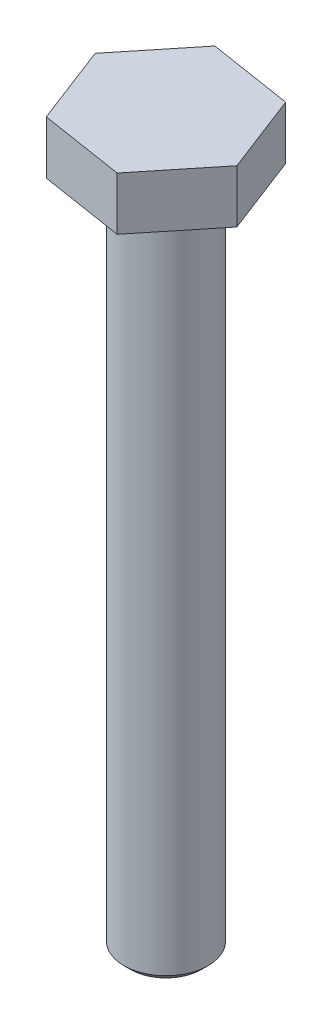
ISO-10303-21;
HEADER;
FILE_DESCRIPTION(('STEP AP214'),'2;1');
FILE_NAME('part.step','',(''),(''),'','','');
FILE_SCHEMA(('AUTOMOTIVE_DESIGN { 1 0 10303 214 1 1 1 1 }'));
ENDSEC;
DATA;
#1=APPLICATION_CONTEXT('core data for automotive mechanical design processes');
#2=APPLICATION_PROTOCOL_DEFINITION('international standard','automotive_design',2000,#1);
#3=PRODUCT_CONTEXT('',#1,'mechanical');
#4=PRODUCT('Part','Part','',(#3));
#5=PRODUCT_RELATED_PRODUCT_CATEGORY('part','',(#4));
#6=PRODUCT_DEFINITION_FORMATION('','',#4);
#7=PRODUCT_DEFINITION_CONTEXT('part definition',#1,'design');
#8=PRODUCT_DEFINITION('design','',#6,#7);
#9=PRODUCT_DEFINITION_SHAPE('','',#8);
#10=(LENGTH_UNIT() NAMED_UNIT(*) SI_UNIT(.MILLI.,.METRE.));
#11=(NAMED_UNIT(*) PLANE_ANGLE_UNIT() SI_UNIT($,.RADIAN.));
#12=(NAMED_UNIT(*) SI_UNIT($,.STERADIAN.) SOLID_ANGLE_UNIT());
#13=UNCERTAINTY_MEASURE_WITH_UNIT(LENGTH_MEASURE(1.E-05),#10,'distance_accuracy_value','');
#14=(GEOMETRIC_REPRESENTATION_CONTEXT(3) GLOBAL_UNCERTAINTY_ASSIGNED_CONTEXT((#13)) GLOBAL_UNIT_ASSIGNED_CONTEXT((#10,
#11,#12)) REPRESENTATION_CONTEXT('',''));
#15=CARTESIAN_POINT('',(0.,0.,0.));
#16=DIRECTION('',(0.,0.,1.));
#17=DIRECTION('',(1.,0.,0.));
#18=AXIS2_PLACEMENT_3D('',#15,#16,#17);
#19=CARTESIAN_POINT('',(0.,50.8,0.));
#20=DIRECTION('',(0.,-1.,0.));
#21=DIRECTION('',(0.,0.,-1.));
#22=AXIS2_PLACEMENT_3D('',#19,#20,#21);
#23=CYLINDRICAL_SURFACE('',#22,3.175);
#24=CARTESIAN_POINT('',(0.,0.499999999999994,0.));
#25=DIRECTION('',(0.,1.,0.));
#26=DIRECTION('',(0.,0.,1.));
#27=AXIS2_PLACEMENT_3D('',#24,#25,#26);
#28=CIRCLE('',#27,3.175);
#29=CARTESIAN_POINT('',(0.,0.499999999999994,3.175));
#30=VERTEX_POINT('',#29);
#31=EDGE_CURVE('E42',#30,#30,#28,.T.);
#32=ORIENTED_EDGE('',*,*,#31,.T.);
#33=EDGE_LOOP('',(#32));
#34=FACE_BOUND('',#33,.T.);
#35=CARTESIAN_POINT('',(0.,50.8,0.));
#36=DIRECTION('',(0.,1.,0.));
#37=DIRECTION('',(0.,0.,1.));
#38=AXIS2_PLACEMENT_3D('',#35,#36,#37);
#39=CIRCLE('',#38,3.175);
#40=CARTESIAN_POINT('',(0.,50.8,3.175));
#41=VERTEX_POINT('',#40);
#42=EDGE_CURVE('E138',#41,#41,#39,.T.);
#43=ORIENTED_EDGE('',*,*,#42,.F.);
#44=EDGE_LOOP('',(#43));
#45=FACE_BOUND('',#44,.T.);
#46=ADVANCED_FACE('F33',(#34,#45),#23,.T.);
#47=CARTESIAN_POINT('',(0.,0.,0.));
#48=DIRECTION('',(0.,1.,0.));
#49=DIRECTION('',(0.,0.,1.));
#50=AXIS2_PLACEMENT_3D('',#47,#48,#49);
#51=PLANE('',#50);
#52=CARTESIAN_POINT('',(0.,0.,0.));
#53=DIRECTION('',(0.,1.,0.));
#54=DIRECTION('',(0.,0.,1.));
#55=AXIS2_PLACEMENT_3D('',#52,#53,#54);
#56=CIRCLE('',#55,2.675);
#57=CARTESIAN_POINT('',(0.,0.,2.675));
#58=VERTEX_POINT('',#57);
#59=EDGE_CURVE('E11',#58,#58,#56,.F.);
#60=ORIENTED_EDGE('',*,*,#59,.T.);
#61=EDGE_LOOP('',(#60));
#62=FACE_BOUND('',#61,.T.);
#63=ADVANCED_FACE('F154',(#62),#51,.F.);
#64=CARTESIAN_POINT('',(0.,50.8,0.));
#65=DIRECTION('',(0.,1.,0.));
#66=DIRECTION('',(0.,0.,1.));
#67=AXIS2_PLACEMENT_3D('',#64,#65,#66);
#68=PLANE('',#67);
#69=DIRECTION('',(-0.987837024090635,0.,-0.155492809595036));
#70=VECTOR('',#69,1.);
#71=CARTESIAN_POINT('',(4.03284171648284,50.8,-4.98986370286091));
#72=LINE('',#71,#70);
#73=CARTESIAN_POINT('',(4.03284171648284,50.8,-4.98986370286091));
#74=VERTEX_POINT('',#73);
#75=CARTESIAN_POINT('',(-2.30492786985801,50.8,-5.98747522734624));
#76=VERTEX_POINT('',#75);
#77=EDGE_CURVE('E119',#74,#76,#72,.T.);
#78=ORIENTED_EDGE('',*,*,#77,.F.);
#79=DIRECTION('',(-0.3592577888302,0.,-0.933238362458828));
#80=VECTOR('',#79,1.);
#81=CARTESIAN_POINT('',(6.33776958634085,50.8,0.997611524485323));
#82=LINE('',#81,#80);
#83=CARTESIAN_POINT('',(6.33776958634085,50.8,0.997611524485323));
#84=VERTEX_POINT('',#83);
#85=EDGE_CURVE('E79',#84,#74,#82,.T.);
#86=ORIENTED_EDGE('',*,*,#85,.F.);
#87=DIRECTION('',(0.628579235260435,0.,-0.777745552863793));
#88=VECTOR('',#87,1.);
#89=CARTESIAN_POINT('',(2.30492786985801,50.8,5.98747522734624));
#90=LINE('',#89,#88);
#91=CARTESIAN_POINT('',(2.30492786985801,50.8,5.98747522734624));
#92=VERTEX_POINT('',#91);
#93=EDGE_CURVE('E73',#92,#84,#90,.T.);
#94=ORIENTED_EDGE('',*,*,#93,.F.);
#95=DIRECTION('',(0.987837024090635,0.,0.155492809595036));
#96=VECTOR('',#95,1.);
#97=CARTESIAN_POINT('',(-4.03284171648284,50.8,4.98986370286091));
#98=LINE('',#97,#96);
#99=CARTESIAN_POINT('',(-4.03284171648284,50.8,4.98986370286091));
#100=VERTEX_POINT('',#99);
#101=EDGE_CURVE('E109',#100,#92,#98,.T.);
#102=ORIENTED_EDGE('',*,*,#101,.F.);
#103=DIRECTION('',(0.3592577888302,0.,0.933238362458828));
#104=VECTOR('',#103,1.);
#105=CARTESIAN_POINT('',(-6.33776958634085,50.8,-0.997611524485325));
#106=LINE('',#105,#104);
#107=CARTESIAN_POINT('',(-6.33776958634085,50.8,-0.997611524485325));
#108=VERTEX_POINT('',#107);
#109=EDGE_CURVE('E124',#108,#100,#106,.T.);
#110=ORIENTED_EDGE('',*,*,#109,.F.);
#111=DIRECTION('',(-0.628579235260435,0.,0.777745552863793));
#112=VECTOR('',#111,1.);
#113=CARTESIAN_POINT('',(-2.30492786985801,50.8,-5.98747522734624));
#114=LINE('',#113,#112);
#115=EDGE_CURVE('E122',#76,#108,#114,.T.);
#116=ORIENTED_EDGE('',*,*,#115,.F.);
#117=EDGE_LOOP('',(#78,#86,#94,#102,#110,#116));
#118=FACE_BOUND('',#117,.T.);
#119=ORIENTED_EDGE('',*,*,#42,.T.);
#120=EDGE_LOOP('',(#119));
#121=FACE_BOUND('',#120,.T.);
#122=ADVANCED_FACE('F159',(#118,#121),#68,.F.);
#123=CARTESIAN_POINT('',(4.03284171648284,54.8,-4.98986370286091));
#124=DIRECTION('',(-0.155492809595036,0.,0.987837024090635));
#125=DIRECTION('',(0.987837024090635,0.,0.155492809595036));
#126=AXIS2_PLACEMENT_3D('',#123,#124,#125);
#127=PLANE('',#126);
#128=ORIENTED_EDGE('',*,*,#77,.T.);
#129=DIRECTION('',(0.,-1.,0.));
#130=VECTOR('',#129,1.);
#131=CARTESIAN_POINT('',(-2.30492786985801,54.8,-5.98747522734624));
#132=LINE('',#131,#130);
#133=CARTESIAN_POINT('',(-2.30492786985801,54.8,-5.98747522734624));
#134=VERTEX_POINT('',#133);
#135=EDGE_CURVE('E136',#134,#76,#132,.T.);
#136=ORIENTED_EDGE('',*,*,#135,.F.);
#137=DIRECTION('',(-0.987837024090635,0.,-0.155492809595036));
#138=VECTOR('',#137,1.);
#139=CARTESIAN_POINT('',(4.03284171648284,54.8,-4.98986370286091));
#140=LINE('',#139,#138);
#141=CARTESIAN_POINT('',(4.03284171648284,54.8,-4.98986370286091));
#142=VERTEX_POINT('',#141);
#143=EDGE_CURVE('E129',#142,#134,#140,.T.);
#144=ORIENTED_EDGE('',*,*,#143,.F.);
#145=DIRECTION('',(0.,-1.,0.));
#146=VECTOR('',#145,1.);
#147=CARTESIAN_POINT('',(4.03284171648284,54.8,-4.98986370286091));
#148=LINE('',#147,#146);
#149=EDGE_CURVE('E115',#142,#74,#148,.T.);
#150=ORIENTED_EDGE('',*,*,#149,.T.);
#151=EDGE_LOOP('',(#128,#136,#144,#150));
#152=FACE_BOUND('',#151,.T.);
#153=ADVANCED_FACE('F163',(#152),#127,.F.);
#154=CARTESIAN_POINT('',(-2.30492786985801,54.8,-5.98747522734624));
#155=DIRECTION('',(0.777745552863793,0.,0.628579235260435));
#156=DIRECTION('',(0.628579235260435,0.,-0.777745552863793));
#157=AXIS2_PLACEMENT_3D('',#154,#155,#156);
#158=PLANE('',#157);
#159=ORIENTED_EDGE('',*,*,#115,.T.);
#160=DIRECTION('',(0.,-1.,0.));
#161=VECTOR('',#160,1.);
#162=CARTESIAN_POINT('',(-6.33776958634085,54.8,-0.997611524485325));
#163=LINE('',#162,#161);
#164=CARTESIAN_POINT('',(-6.33776958634085,54.8,-0.997611524485325));
#165=VERTEX_POINT('',#164);
#166=EDGE_CURVE('E133',#165,#108,#163,.T.);
#167=ORIENTED_EDGE('',*,*,#166,.F.);
#168=DIRECTION('',(-0.628579235260435,0.,0.777745552863793));
#169=VECTOR('',#168,1.);
#170=CARTESIAN_POINT('',(-2.30492786985801,54.8,-5.98747522734624));
#171=LINE('',#170,#169);
#172=EDGE_CURVE('E88',#134,#165,#171,.T.);
#173=ORIENTED_EDGE('',*,*,#172,.F.);
#174=ORIENTED_EDGE('',*,*,#135,.T.);
#175=EDGE_LOOP('',(#159,#167,#173,#174));
#176=FACE_BOUND('',#175,.T.);
#177=ADVANCED_FACE('F166',(#176),#158,.F.);
#178=CARTESIAN_POINT('',(-6.33776958634085,54.8,-0.997611524485325));
#179=DIRECTION('',(0.933238362458828,0.,-0.3592577888302));
#180=DIRECTION('',(-0.3592577888302,0.,-0.933238362458828));
#181=AXIS2_PLACEMENT_3D('',#178,#179,#180);
#182=PLANE('',#181);
#183=ORIENTED_EDGE('',*,*,#109,.T.);
#184=DIRECTION('',(0.,-1.,0.));
#185=VECTOR('',#184,1.);
#186=CARTESIAN_POINT('',(-4.03284171648284,54.8,4.98986370286091));
#187=LINE('',#186,#185);
#188=CARTESIAN_POINT('',(-4.03284171648284,54.8,4.98986370286091));
#189=VERTEX_POINT('',#188);
#190=EDGE_CURVE('E110',#189,#100,#187,.T.);
#191=ORIENTED_EDGE('',*,*,#190,.F.);
#192=DIRECTION('',(0.3592577888302,0.,0.933238362458828));
#193=VECTOR('',#192,1.);
#194=CARTESIAN_POINT('',(-6.33776958634085,54.8,-0.997611524485325));
#195=LINE('',#194,#193);
#196=EDGE_CURVE('E101',#165,#189,#195,.T.);
#197=ORIENTED_EDGE('',*,*,#196,.F.);
#198=ORIENTED_EDGE('',*,*,#166,.T.);
#199=EDGE_LOOP('',(#183,#191,#197,#198));
#200=FACE_BOUND('',#199,.T.);
#201=ADVANCED_FACE('F170',(#200),#182,.F.);
#202=CARTESIAN_POINT('',(-4.03284171648284,54.8,4.98986370286091));
#203=DIRECTION('',(0.155492809595036,0.,-0.987837024090635));
#204=DIRECTION('',(-0.987837024090635,0.,-0.155492809595036));
#205=AXIS2_PLACEMENT_3D('',#202,#203,#204);
#206=PLANE('',#205);
#207=ORIENTED_EDGE('',*,*,#101,.T.);
#208=DIRECTION('',(0.,-1.,0.));
#209=VECTOR('',#208,1.);
#210=CARTESIAN_POINT('',(2.30492786985801,54.8,5.98747522734624));
#211=LINE('',#210,#209);
#212=CARTESIAN_POINT('',(2.30492786985801,54.8,5.98747522734624));
#213=VERTEX_POINT('',#212);
#214=EDGE_CURVE('E106',#213,#92,#211,.T.);
#215=ORIENTED_EDGE('',*,*,#214,.F.);
#216=DIRECTION('',(0.987837024090635,0.,0.155492809595036));
#217=VECTOR('',#216,1.);
#218=CARTESIAN_POINT('',(-4.03284171648284,54.8,4.98986370286091));
#219=LINE('',#218,#217);
#220=EDGE_CURVE('E95',#189,#213,#219,.T.);
#221=ORIENTED_EDGE('',*,*,#220,.F.);
#222=ORIENTED_EDGE('',*,*,#190,.T.);
#223=EDGE_LOOP('',(#207,#215,#221,#222));
#224=FACE_BOUND('',#223,.T.);
#225=ADVANCED_FACE('F107',(#224),#206,.F.);
#226=CARTESIAN_POINT('',(2.30492786985801,54.8,5.98747522734624));
#227=DIRECTION('',(-0.777745552863793,0.,-0.628579235260435));
#228=DIRECTION('',(-0.628579235260435,0.,0.777745552863793));
#229=AXIS2_PLACEMENT_3D('',#226,#227,#228);
#230=PLANE('',#229);
#231=ORIENTED_EDGE('',*,*,#93,.T.);
#232=DIRECTION('',(0.,-1.,0.));
#233=VECTOR('',#232,1.);
#234=CARTESIAN_POINT('',(6.33776958634085,54.8,0.997611524485323));
#235=LINE('',#234,#233);
#236=CARTESIAN_POINT('',(6.33776958634085,54.8,0.997611524485323));
#237=VERTEX_POINT('',#236);
#238=EDGE_CURVE('E111',#237,#84,#235,.T.);
#239=ORIENTED_EDGE('',*,*,#238,.F.);
#240=DIRECTION('',(0.628579235260435,0.,-0.777745552863793));
#241=VECTOR('',#240,1.);
#242=CARTESIAN_POINT('',(2.30492786985801,54.8,5.98747522734624));
#243=LINE('',#242,#241);
#244=EDGE_CURVE('E99',#213,#237,#243,.T.);
#245=ORIENTED_EDGE('',*,*,#244,.F.);
#246=ORIENTED_EDGE('',*,*,#214,.T.);
#247=EDGE_LOOP('',(#231,#239,#245,#246));
#248=FACE_BOUND('',#247,.T.);
#249=ADVANCED_FACE('F113',(#248),#230,.F.);
#250=CARTESIAN_POINT('',(6.33776958634085,54.8,0.997611524485323));
#251=DIRECTION('',(-0.933238362458828,0.,0.3592577888302));
#252=DIRECTION('',(0.3592577888302,0.,0.933238362458828));
#253=AXIS2_PLACEMENT_3D('',#250,#251,#252);
#254=PLANE('',#253);
#255=ORIENTED_EDGE('',*,*,#85,.T.);
#256=ORIENTED_EDGE('',*,*,#149,.F.);
#257=DIRECTION('',(-0.3592577888302,0.,-0.933238362458828));
#258=VECTOR('',#257,1.);
#259=CARTESIAN_POINT('',(6.33776958634085,54.8,0.997611524485323));
#260=LINE('',#259,#258);
#261=EDGE_CURVE('E50',#237,#142,#260,.T.);
#262=ORIENTED_EDGE('',*,*,#261,.F.);
#263=ORIENTED_EDGE('',*,*,#238,.T.);
#264=EDGE_LOOP('',(#255,#256,#262,#263));
#265=FACE_BOUND('',#264,.T.);
#266=ADVANCED_FACE('F150',(#265),#254,.F.);
#267=CARTESIAN_POINT('',(0.,54.8,0.));
#268=DIRECTION('',(0.,1.,0.));
#269=DIRECTION('',(0.,0.,1.));
#270=AXIS2_PLACEMENT_3D('',#267,#268,#269);
#271=PLANE('',#270);
#272=ORIENTED_EDGE('',*,*,#143,.T.);
#273=ORIENTED_EDGE('',*,*,#172,.T.);
#274=ORIENTED_EDGE('',*,*,#196,.T.);
#275=ORIENTED_EDGE('',*,*,#220,.T.);
#276=ORIENTED_EDGE('',*,*,#244,.T.);
#277=ORIENTED_EDGE('',*,*,#261,.T.);
#278=EDGE_LOOP('',(#272,#273,#274,#275,#276,#277));
#279=FACE_BOUND('',#278,.T.);
#280=ADVANCED_FACE('F97',(#279),#271,.T.);
#281=CARTESIAN_POINT('',(0.,0.499999999999994,0.));
#282=DIRECTION('',(0.,1.,0.));
#283=DIRECTION('',(0.,0.,1.));
#284=AXIS2_PLACEMENT_3D('',#281,#282,#283);
#285=CONICAL_SURFACE('',#284,3.175,0.78539816339745);
#286=ORIENTED_EDGE('',*,*,#59,.F.);
#287=EDGE_LOOP('',(#286));
#288=FACE_BOUND('',#287,.T.);
#289=ORIENTED_EDGE('',*,*,#31,.F.);
#290=EDGE_LOOP('',(#289));
#291=FACE_BOUND('',#290,.T.);
#292=ADVANCED_FACE('F35',(#288,#291),#285,.T.);
#293=CLOSED_SHELL('',(#46,#63,#122,#153,#177,#201,#225,#249,#266,#280,#292));
#294=MANIFOLD_SOLID_BREP('B2',#293);
#295=ADVANCED_BREP_SHAPE_REPRESENTATION('',(#18,#294),#14);
#296=SHAPE_DEFINITION_REPRESENTATION(#9,#295);
ENDSEC;
END-ISO-10303-21;
